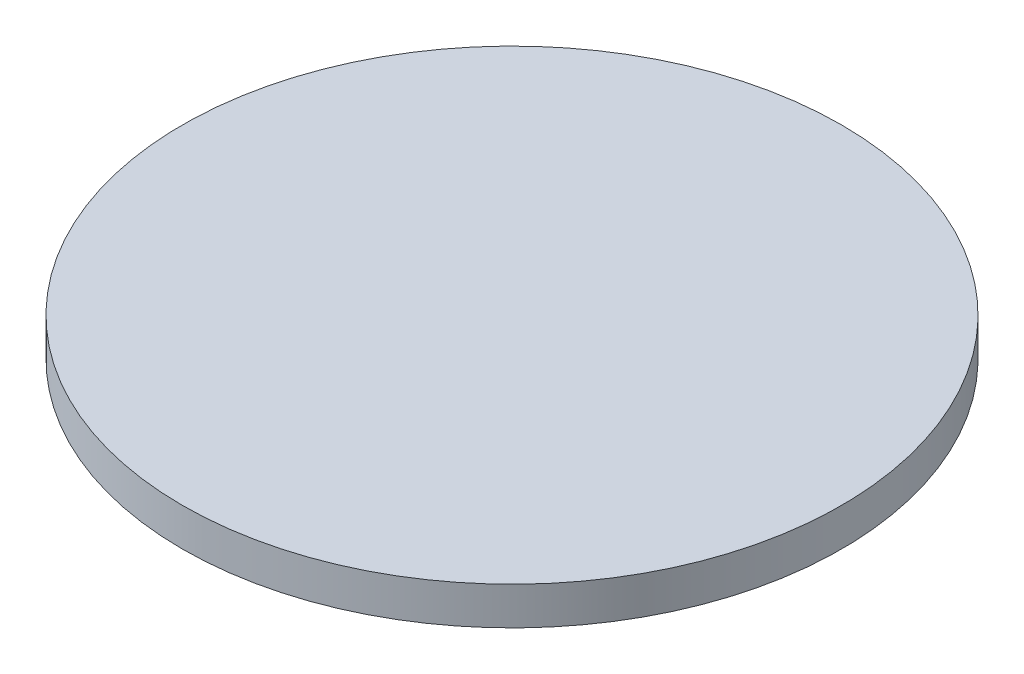
ISO-10303-21;
HEADER;
FILE_DESCRIPTION(('STEP AP214'),'2;1');
FILE_NAME('part.step','',(''),(''),'','','');
FILE_SCHEMA(('AUTOMOTIVE_DESIGN { 1 0 10303 214 1 1 1 1 }'));
ENDSEC;
DATA;
#1=APPLICATION_CONTEXT('core data for automotive mechanical design processes');
#2=APPLICATION_PROTOCOL_DEFINITION('international standard','automotive_design',2000,#1);
#3=PRODUCT_CONTEXT('',#1,'mechanical');
#4=PRODUCT('Part','Part','',(#3));
#5=PRODUCT_RELATED_PRODUCT_CATEGORY('part','',(#4));
#6=PRODUCT_DEFINITION_FORMATION('','',#4);
#7=PRODUCT_DEFINITION_CONTEXT('part definition',#1,'design');
#8=PRODUCT_DEFINITION('design','',#6,#7);
#9=PRODUCT_DEFINITION_SHAPE('','',#8);
#10=(LENGTH_UNIT() NAMED_UNIT(*) SI_UNIT(.MILLI.,.METRE.));
#11=(NAMED_UNIT(*) PLANE_ANGLE_UNIT() SI_UNIT($,.RADIAN.));
#12=(NAMED_UNIT(*) SI_UNIT($,.STERADIAN.) SOLID_ANGLE_UNIT());
#13=UNCERTAINTY_MEASURE_WITH_UNIT(LENGTH_MEASURE(1.E-05),#10,'distance_accuracy_value','');
#14=(GEOMETRIC_REPRESENTATION_CONTEXT(3) GLOBAL_UNCERTAINTY_ASSIGNED_CONTEXT((#13)) GLOBAL_UNIT_ASSIGNED_CONTEXT((#10,
#11,#12)) REPRESENTATION_CONTEXT('',''));
#15=CARTESIAN_POINT('',(0.,0.,0.));
#16=DIRECTION('',(0.,0.,1.));
#17=DIRECTION('',(1.,0.,0.));
#18=AXIS2_PLACEMENT_3D('',#15,#16,#17);
#19=CARTESIAN_POINT('',(7.23053698436615,22.,-24.5256699897141));
#20=DIRECTION('',(0.,-1.,0.));
#21=DIRECTION('',(0.,0.,-1.));
#22=AXIS2_PLACEMENT_3D('',#19,#20,#21);
#23=CYLINDRICAL_SURFACE('',#22,13.0637102317642);
#24=CARTESIAN_POINT('',(7.23053698436615,20.5,-24.5256699897141));
#25=DIRECTION('',(0.,1.,0.));
#26=DIRECTION('',(0.,0.,1.));
#27=AXIS2_PLACEMENT_3D('',#24,#25,#26);
#28=CIRCLE('',#27,13.0637102317642);
#29=CARTESIAN_POINT('',(7.23053698436615,20.5,-11.4619597579499));
#30=VERTEX_POINT('',#29);
#31=EDGE_CURVE('E44',#30,#30,#28,.T.);
#32=ORIENTED_EDGE('',*,*,#31,.T.);
#33=EDGE_LOOP('',(#32));
#34=FACE_BOUND('',#33,.T.);
#35=CARTESIAN_POINT('',(7.23053698436615,22.,-24.5256699897141));
#36=DIRECTION('',(0.,1.,0.));
#37=DIRECTION('',(0.,0.,1.));
#38=AXIS2_PLACEMENT_3D('',#35,#36,#37);
#39=CIRCLE('',#38,13.0637102317642);
#40=CARTESIAN_POINT('',(7.23053698436615,22.,-11.4619597579499));
#41=VERTEX_POINT('',#40);
#42=EDGE_CURVE('E10',#41,#41,#39,.T.);
#43=ORIENTED_EDGE('',*,*,#42,.F.);
#44=EDGE_LOOP('',(#43));
#45=FACE_BOUND('',#44,.T.);
#46=ADVANCED_FACE('F41',(#34,#45),#23,.T.);
#47=CARTESIAN_POINT('',(7.23053698436615,22.,-24.5256699897141));
#48=DIRECTION('',(0.,1.,0.));
#49=DIRECTION('',(0.,0.,1.));
#50=AXIS2_PLACEMENT_3D('',#47,#48,#49);
#51=PLANE('',#50);
#52=ORIENTED_EDGE('',*,*,#42,.T.);
#53=EDGE_LOOP('',(#52));
#54=FACE_BOUND('',#53,.T.);
#55=ADVANCED_FACE('F59',(#54),#51,.T.);
#56=CARTESIAN_POINT('',(7.23053698436615,20.5,-24.5256699897141));
#57=DIRECTION('',(0.,1.,0.));
#58=DIRECTION('',(0.,0.,1.));
#59=AXIS2_PLACEMENT_3D('',#56,#57,#58);
#60=PLANE('',#59);
#61=ORIENTED_EDGE('',*,*,#31,.F.);
#62=EDGE_LOOP('',(#61));
#63=FACE_BOUND('',#62,.T.);
#64=ADVANCED_FACE('F57',(#63),#60,.F.);
#65=CLOSED_SHELL('',(#46,#55,#64));
#66=MANIFOLD_SOLID_BREP('B2',#65);
#67=ADVANCED_BREP_SHAPE_REPRESENTATION('',(#18,#66),#14);
#68=SHAPE_DEFINITION_REPRESENTATION(#9,#67);
ENDSEC;
END-ISO-10303-21;
